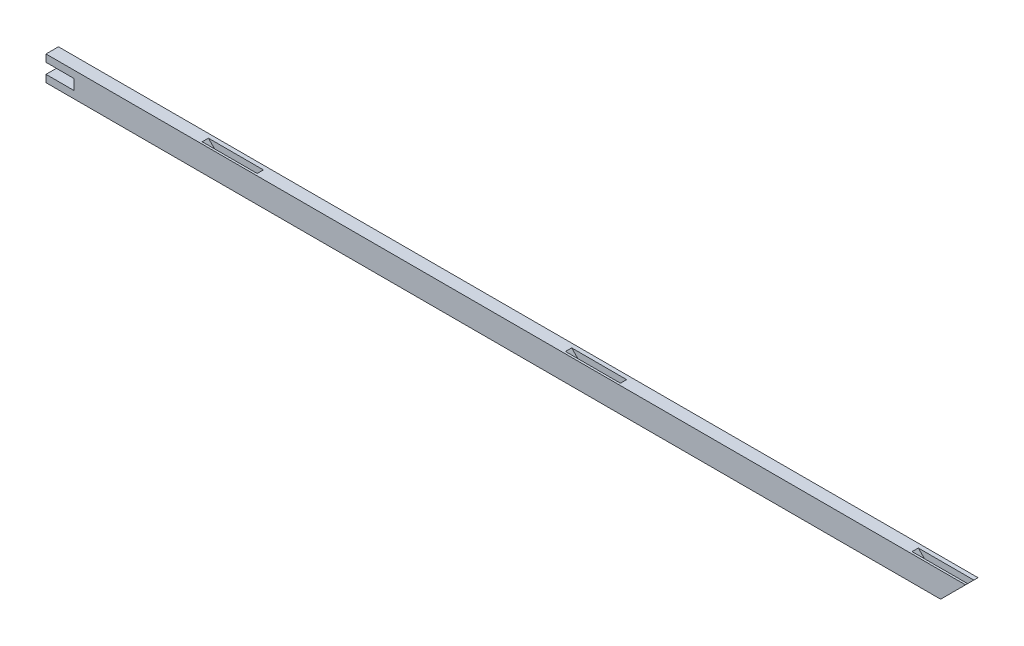
ISO-10303-21;
HEADER;
FILE_DESCRIPTION(('STEP AP214'),'2;1');
FILE_NAME('part.step','',(''),(''),'','','');
FILE_SCHEMA(('AUTOMOTIVE_DESIGN { 1 0 10303 214 1 1 1 1 }'));
ENDSEC;
DATA;
#1=APPLICATION_CONTEXT('core data for automotive mechanical design processes');
#2=APPLICATION_PROTOCOL_DEFINITION('international standard','automotive_design',2000,#1);
#3=PRODUCT_CONTEXT('',#1,'mechanical');
#4=PRODUCT('Part','Part','',(#3));
#5=PRODUCT_RELATED_PRODUCT_CATEGORY('part','',(#4));
#6=PRODUCT_DEFINITION_FORMATION('','',#4);
#7=PRODUCT_DEFINITION_CONTEXT('part definition',#1,'design');
#8=PRODUCT_DEFINITION('design','',#6,#7);
#9=PRODUCT_DEFINITION_SHAPE('','',#8);
#10=(LENGTH_UNIT() NAMED_UNIT(*) SI_UNIT(.MILLI.,.METRE.));
#11=(NAMED_UNIT(*) PLANE_ANGLE_UNIT() SI_UNIT($,.RADIAN.));
#12=(NAMED_UNIT(*) SI_UNIT($,.STERADIAN.) SOLID_ANGLE_UNIT());
#13=UNCERTAINTY_MEASURE_WITH_UNIT(LENGTH_MEASURE(1.E-05),#10,'distance_accuracy_value','');
#14=(GEOMETRIC_REPRESENTATION_CONTEXT(3) GLOBAL_UNCERTAINTY_ASSIGNED_CONTEXT((#13)) GLOBAL_UNIT_ASSIGNED_CONTEXT((#10,
#11,#12)) REPRESENTATION_CONTEXT('',''));
#15=CARTESIAN_POINT('',(0.,0.,0.));
#16=DIRECTION('',(0.,0.,1.));
#17=DIRECTION('',(1.,0.,0.));
#18=AXIS2_PLACEMENT_3D('',#15,#16,#17);
#19=CARTESIAN_POINT('',(886.,12.0000000000004,12.));
#20=DIRECTION('',(0.,-1.,0.));
#21=DIRECTION('',(1.,0.,0.));
#22=AXIS2_PLACEMENT_3D('',#19,#20,#21);
#23=PLANE('',#22);
#24=DIRECTION('',(0.,0.,1.));
#25=VECTOR('',#24,1.);
#26=CARTESIAN_POINT('',(148.5,12.,10.));
#27=LINE('',#26,#25);
#28=CARTESIAN_POINT('',(148.5,12.,10.));
#29=VERTEX_POINT('',#28);
#30=CARTESIAN_POINT('',(148.5,12.,4.));
#31=VERTEX_POINT('',#30);
#32=EDGE_CURVE('E437',#29,#31,#27,.F.);
#33=ORIENTED_EDGE('',*,*,#32,.T.);
#34=DIRECTION('',(1.,0.,0.));
#35=VECTOR('',#34,1.);
#36=CARTESIAN_POINT('',(155.,12.,4.));
#37=LINE('',#36,#35);
#38=CARTESIAN_POINT('',(201.5,12.,4.00000000000001));
#39=VERTEX_POINT('',#38);
#40=EDGE_CURVE('E451',#31,#39,#37,.T.);
#41=ORIENTED_EDGE('',*,*,#40,.T.);
#42=DIRECTION('',(0.,0.,-1.));
#43=VECTOR('',#42,1.);
#44=CARTESIAN_POINT('',(201.5,12.,4.00000000000001));
#45=LINE('',#44,#43);
#46=CARTESIAN_POINT('',(201.5,12.,10.));
#47=VERTEX_POINT('',#46);
#48=EDGE_CURVE('E457',#39,#47,#45,.F.);
#49=ORIENTED_EDGE('',*,*,#48,.T.);
#50=DIRECTION('',(-1.,0.,0.));
#51=VECTOR('',#50,1.);
#52=CARTESIAN_POINT('',(195.,12.,10.));
#53=LINE('',#52,#51);
#54=EDGE_CURVE('E425',#47,#29,#53,.T.);
#55=ORIENTED_EDGE('',*,*,#54,.T.);
#56=EDGE_LOOP('',(#33,#41,#49,#55));
#57=FACE_BOUND('',#56,.T.);
#58=DIRECTION('',(0.,0.,1.));
#59=VECTOR('',#58,1.);
#60=CARTESIAN_POINT('',(498.5,12.,10.));
#61=LINE('',#60,#59);
#62=CARTESIAN_POINT('',(498.5,12.,10.));
#63=VERTEX_POINT('',#62);
#64=CARTESIAN_POINT('',(498.5,12.,4.));
#65=VERTEX_POINT('',#64);
#66=EDGE_CURVE('E471',#63,#65,#61,.F.);
#67=ORIENTED_EDGE('',*,*,#66,.T.);
#68=DIRECTION('',(1.,0.,0.));
#69=VECTOR('',#68,1.);
#70=CARTESIAN_POINT('',(505.,12.,4.));
#71=LINE('',#70,#69);
#72=CARTESIAN_POINT('',(551.5,12.,4.00000000000001));
#73=VERTEX_POINT('',#72);
#74=EDGE_CURVE('E485',#65,#73,#71,.T.);
#75=ORIENTED_EDGE('',*,*,#74,.T.);
#76=DIRECTION('',(0.,0.,-1.));
#77=VECTOR('',#76,1.);
#78=CARTESIAN_POINT('',(551.5,12.,4.00000000000001));
#79=LINE('',#78,#77);
#80=CARTESIAN_POINT('',(551.5,12.,10.));
#81=VERTEX_POINT('',#80);
#82=EDGE_CURVE('E11',#73,#81,#79,.F.);
#83=ORIENTED_EDGE('',*,*,#82,.T.);
#84=DIRECTION('',(-1.,0.,0.));
#85=VECTOR('',#84,1.);
#86=CARTESIAN_POINT('',(545.,12.,10.));
#87=LINE('',#86,#85);
#88=EDGE_CURVE('E459',#81,#63,#87,.T.);
#89=ORIENTED_EDGE('',*,*,#88,.T.);
#90=EDGE_LOOP('',(#67,#75,#83,#89));
#91=FACE_BOUND('',#90,.T.);
#92=DIRECTION('',(-1.,0.,0.));
#93=VECTOR('',#92,1.);
#94=CARTESIAN_POINT('',(886.,12.0000000000004,4.));
#95=LINE('',#94,#93);
#96=CARTESIAN_POINT('',(886.,12.0000000000004,4.));
#97=VERTEX_POINT('',#96);
#98=CARTESIAN_POINT('',(832.5,12.0000000000004,4.));
#99=VERTEX_POINT('',#98);
#100=EDGE_CURVE('E256',#97,#99,#95,.T.);
#101=ORIENTED_EDGE('',*,*,#100,.F.);
#102=DIRECTION('',(0.,0.,-1.));
#103=VECTOR('',#102,1.);
#104=CARTESIAN_POINT('',(886.,12.0000000000004,12.));
#105=LINE('',#104,#103);
#106=CARTESIAN_POINT('',(886.,12.0000000000004,0.));
#107=VERTEX_POINT('',#106);
#108=EDGE_CURVE('E338',#97,#107,#105,.T.);
#109=ORIENTED_EDGE('',*,*,#108,.T.);
#110=DIRECTION('',(-1.,0.,0.));
#111=VECTOR('',#110,1.);
#112=CARTESIAN_POINT('',(886.,12.0000000000004,0.));
#113=LINE('',#112,#111);
#114=CARTESIAN_POINT('',(0.,12.0000000000002,0.));
#115=VERTEX_POINT('',#114);
#116=EDGE_CURVE('E339',#107,#115,#113,.T.);
#117=ORIENTED_EDGE('',*,*,#116,.T.);
#118=DIRECTION('',(0.,0.,-1.));
#119=VECTOR('',#118,1.);
#120=CARTESIAN_POINT('',(0.,12.0000000000002,12.));
#121=LINE('',#120,#119);
#122=CARTESIAN_POINT('',(0.,12.0000000000002,12.));
#123=VERTEX_POINT('',#122);
#124=EDGE_CURVE('E379',#123,#115,#121,.T.);
#125=ORIENTED_EDGE('',*,*,#124,.F.);
#126=DIRECTION('',(-1.,0.,0.));
#127=VECTOR('',#126,1.);
#128=CARTESIAN_POINT('',(886.,12.0000000000004,12.));
#129=LINE('',#128,#127);
#130=CARTESIAN_POINT('',(886.,12.0000000000004,12.));
#131=VERTEX_POINT('',#130);
#132=EDGE_CURVE('E320',#131,#123,#129,.T.);
#133=ORIENTED_EDGE('',*,*,#132,.F.);
#134=CARTESIAN_POINT('',(886.,12.0000000000004,10.));
#135=VERTEX_POINT('',#134);
#136=EDGE_CURVE('E358',#131,#135,#105,.T.);
#137=ORIENTED_EDGE('',*,*,#136,.T.);
#138=DIRECTION('',(-1.,0.,0.));
#139=VECTOR('',#138,1.);
#140=CARTESIAN_POINT('',(886.,12.0000000000004,10.));
#141=LINE('',#140,#139);
#142=CARTESIAN_POINT('',(832.5,12.0000000000004,10.));
#143=VERTEX_POINT('',#142);
#144=EDGE_CURVE('E58',#135,#143,#141,.T.);
#145=ORIENTED_EDGE('',*,*,#144,.T.);
#146=DIRECTION('',(0.,0.,1.));
#147=VECTOR('',#146,1.);
#148=CARTESIAN_POINT('',(832.5,12.0000000000004,4.));
#149=LINE('',#148,#147);
#150=EDGE_CURVE('E250',#99,#143,#149,.T.);
#151=ORIENTED_EDGE('',*,*,#150,.F.);
#152=EDGE_LOOP('',(#101,#109,#117,#125,#133,#137,#145,#151));
#153=FACE_BOUND('',#152,.T.);
#154=ADVANCED_FACE('F35',(#57,#91,#153),#23,.F.);
#155=CARTESIAN_POINT('',(862.,-12.,12.));
#156=DIRECTION('',(-0.707106781186551,0.707106781186544,0.));
#157=DIRECTION('',(-0.707106781186544,-0.707106781186551,0.));
#158=AXIS2_PLACEMENT_3D('',#155,#156,#157);
#159=PLANE('',#158);
#160=DIRECTION('',(0.707106781186532,0.707106781186562,0.));
#161=VECTOR('',#160,1.);
#162=CARTESIAN_POINT('',(879.5,5.50000000000037,4.));
#163=LINE('',#162,#161);
#164=CARTESIAN_POINT('',(879.5,5.50000000000037,4.));
#165=VERTEX_POINT('',#164);
#166=EDGE_CURVE('E261',#165,#97,#163,.T.);
#167=ORIENTED_EDGE('',*,*,#166,.F.);
#168=DIRECTION('',(0.,0.,1.));
#169=VECTOR('',#168,1.);
#170=CARTESIAN_POINT('',(879.5,5.50000000000037,4.));
#171=LINE('',#170,#169);
#172=CARTESIAN_POINT('',(879.5,5.50000000000037,10.));
#173=VERTEX_POINT('',#172);
#174=EDGE_CURVE('E268',#165,#173,#171,.T.);
#175=ORIENTED_EDGE('',*,*,#174,.T.);
#176=DIRECTION('',(0.707106781186532,0.707106781186562,0.));
#177=VECTOR('',#176,1.);
#178=CARTESIAN_POINT('',(879.5,5.50000000000037,10.));
#179=LINE('',#178,#177);
#180=EDGE_CURVE('E264',#173,#135,#179,.T.);
#181=ORIENTED_EDGE('',*,*,#180,.T.);
#182=ORIENTED_EDGE('',*,*,#136,.F.);
#183=DIRECTION('',(0.707106781186544,0.707106781186551,0.));
#184=VECTOR('',#183,1.);
#185=CARTESIAN_POINT('',(862.,-12.,12.));
#186=LINE('',#185,#184);
#187=CARTESIAN_POINT('',(862.,-12.,12.));
#188=VERTEX_POINT('',#187);
#189=EDGE_CURVE('E336',#188,#131,#186,.T.);
#190=ORIENTED_EDGE('',*,*,#189,.F.);
#191=DIRECTION('',(0.,0.,-1.));
#192=VECTOR('',#191,1.);
#193=CARTESIAN_POINT('',(862.,-12.,12.));
#194=LINE('',#193,#192);
#195=CARTESIAN_POINT('',(862.,-12.,10.));
#196=VERTEX_POINT('',#195);
#197=EDGE_CURVE('E361',#188,#196,#194,.T.);
#198=ORIENTED_EDGE('',*,*,#197,.T.);
#199=DIRECTION('',(0.707106781186545,0.70710678118655,0.));
#200=VECTOR('',#199,1.);
#201=CARTESIAN_POINT('',(868.5,-5.50000000000001,10.));
#202=LINE('',#201,#200);
#203=CARTESIAN_POINT('',(868.5,-5.50000000000001,10.));
#204=VERTEX_POINT('',#203);
#205=EDGE_CURVE('E286',#196,#204,#202,.T.);
#206=ORIENTED_EDGE('',*,*,#205,.T.);
#207=DIRECTION('',(0.,0.,1.));
#208=VECTOR('',#207,1.);
#209=CARTESIAN_POINT('',(868.5,-5.50000000000001,4.));
#210=LINE('',#209,#208);
#211=CARTESIAN_POINT('',(868.5,-5.50000000000001,4.));
#212=VERTEX_POINT('',#211);
#213=EDGE_CURVE('E285',#212,#204,#210,.T.);
#214=ORIENTED_EDGE('',*,*,#213,.F.);
#215=DIRECTION('',(0.707106781186545,0.70710678118655,0.));
#216=VECTOR('',#215,1.);
#217=CARTESIAN_POINT('',(868.5,-5.50000000000001,4.));
#218=LINE('',#217,#216);
#219=CARTESIAN_POINT('',(862.,-12.,4.));
#220=VERTEX_POINT('',#219);
#221=EDGE_CURVE('E273',#220,#212,#218,.T.);
#222=ORIENTED_EDGE('',*,*,#221,.F.);
#223=CARTESIAN_POINT('',(862.,-12.,0.));
#224=VERTEX_POINT('',#223);
#225=EDGE_CURVE('E360',#220,#224,#194,.T.);
#226=ORIENTED_EDGE('',*,*,#225,.T.);
#227=DIRECTION('',(0.707106781186544,0.707106781186551,0.));
#228=VECTOR('',#227,1.);
#229=CARTESIAN_POINT('',(862.,-12.,0.));
#230=LINE('',#229,#228);
#231=EDGE_CURVE('E324',#224,#107,#230,.T.);
#232=ORIENTED_EDGE('',*,*,#231,.T.);
#233=ORIENTED_EDGE('',*,*,#108,.F.);
#234=EDGE_LOOP('',(#167,#175,#181,#182,#190,#198,#206,#214,#222,#226,#232,#233));
#235=FACE_BOUND('',#234,.T.);
#236=ADVANCED_FACE('F505',(#235),#159,.F.);
#237=CARTESIAN_POINT('',(545.,5.5,4.00000000000001));
#238=DIRECTION('',(-0.707106781186546,0.707106781186549,0.));
#239=DIRECTION('',(0.707106781186549,0.707106781186546,0.));
#240=AXIS2_PLACEMENT_3D('',#237,#238,#239);
#241=PLANE('',#240);
#242=ORIENTED_EDGE('',*,*,#82,.F.);
#243=DIRECTION('',(-0.707106781186549,-0.707106781186546,0.));
#244=VECTOR('',#243,1.);
#245=CARTESIAN_POINT('',(525.,-14.5,4.));
#246=LINE('',#245,#244);
#247=CARTESIAN_POINT('',(545.,5.5,4.00000000000001));
#248=VERTEX_POINT('',#247);
#249=EDGE_CURVE('E43',#248,#73,#246,.F.);
#250=ORIENTED_EDGE('',*,*,#249,.F.);
#251=DIRECTION('',(0.,0.,1.));
#252=VECTOR('',#251,1.);
#253=CARTESIAN_POINT('',(545.,5.5,4.00000000000001));
#254=LINE('',#253,#252);
#255=CARTESIAN_POINT('',(545.,5.5,10.));
#256=VERTEX_POINT('',#255);
#257=EDGE_CURVE('E483',#248,#256,#254,.T.);
#258=ORIENTED_EDGE('',*,*,#257,.T.);
#259=DIRECTION('',(-0.707106781186549,-0.707106781186546,0.));
#260=VECTOR('',#259,1.);
#261=CARTESIAN_POINT('',(545.,5.5,10.));
#262=LINE('',#261,#260);
#263=EDGE_CURVE('E468',#256,#81,#262,.F.);
#264=ORIENTED_EDGE('',*,*,#263,.T.);
#265=EDGE_LOOP('',(#242,#250,#258,#264));
#266=FACE_BOUND('',#265,.T.);
#267=ADVANCED_FACE('F37',(#266),#241,.T.);
#268=CARTESIAN_POINT('',(505.,5.5,4.));
#269=DIRECTION('',(0.,0.,-1.));
#270=DIRECTION('',(-1.,0.,0.));
#271=AXIS2_PLACEMENT_3D('',#268,#269,#270);
#272=PLANE('',#271);
#273=ORIENTED_EDGE('',*,*,#74,.F.);
#274=DIRECTION('',(0.707106781186549,-0.707106781186546,0.));
#275=VECTOR('',#274,1.);
#276=CARTESIAN_POINT('',(505.,5.5,4.));
#277=LINE('',#276,#275);
#278=CARTESIAN_POINT('',(505.,5.5,4.));
#279=VERTEX_POINT('',#278);
#280=EDGE_CURVE('E474',#279,#65,#277,.F.);
#281=ORIENTED_EDGE('',*,*,#280,.F.);
#282=DIRECTION('',(1.,0.,0.));
#283=VECTOR('',#282,1.);
#284=CARTESIAN_POINT('',(505.,5.5,4.));
#285=LINE('',#284,#283);
#286=EDGE_CURVE('E480',#279,#248,#285,.T.);
#287=ORIENTED_EDGE('',*,*,#286,.T.);
#288=ORIENTED_EDGE('',*,*,#249,.T.);
#289=EDGE_LOOP('',(#273,#281,#287,#288));
#290=FACE_BOUND('',#289,.T.);
#291=ADVANCED_FACE('F489',(#290),#272,.F.);
#292=CARTESIAN_POINT('',(350.,5.5,0.));
#293=DIRECTION('',(0.,1.,0.));
#294=DIRECTION('',(0.,0.,-1.));
#295=AXIS2_PLACEMENT_3D('',#292,#293,#294);
#296=PLANE('',#295);
#297=DIRECTION('',(-1.,0.,0.));
#298=VECTOR('',#297,1.);
#299=CARTESIAN_POINT('',(545.,5.5,10.));
#300=LINE('',#299,#298);
#301=CARTESIAN_POINT('',(505.,5.5,10.));
#302=VERTEX_POINT('',#301);
#303=EDGE_CURVE('E465',#256,#302,#300,.T.);
#304=ORIENTED_EDGE('',*,*,#303,.F.);
#305=ORIENTED_EDGE('',*,*,#257,.F.);
#306=ORIENTED_EDGE('',*,*,#286,.F.);
#307=DIRECTION('',(0.,0.,-1.));
#308=VECTOR('',#307,1.);
#309=CARTESIAN_POINT('',(505.,5.5,10.));
#310=LINE('',#309,#308);
#311=EDGE_CURVE('E477',#302,#279,#310,.T.);
#312=ORIENTED_EDGE('',*,*,#311,.F.);
#313=EDGE_LOOP('',(#304,#305,#306,#312));
#314=FACE_BOUND('',#313,.T.);
#315=ADVANCED_FACE('F503',(#314),#296,.T.);
#316=CARTESIAN_POINT('',(505.,5.5,10.));
#317=DIRECTION('',(0.707106781186546,0.707106781186549,0.));
#318=DIRECTION('',(0.707106781186549,-0.707106781186546,0.));
#319=AXIS2_PLACEMENT_3D('',#316,#317,#318);
#320=PLANE('',#319);
#321=ORIENTED_EDGE('',*,*,#66,.F.);
#322=DIRECTION('',(0.707106781186549,-0.707106781186546,0.));
#323=VECTOR('',#322,1.);
#324=CARTESIAN_POINT('',(525.,-14.5,10.));
#325=LINE('',#324,#323);
#326=EDGE_CURVE('E462',#302,#63,#325,.F.);
#327=ORIENTED_EDGE('',*,*,#326,.F.);
#328=ORIENTED_EDGE('',*,*,#311,.T.);
#329=ORIENTED_EDGE('',*,*,#280,.T.);
#330=EDGE_LOOP('',(#321,#327,#328,#329));
#331=FACE_BOUND('',#330,.T.);
#332=ADVANCED_FACE('F497',(#331),#320,.T.);
#333=CARTESIAN_POINT('',(545.,5.5,10.));
#334=DIRECTION('',(0.,0.,1.));
#335=DIRECTION('',(1.,0.,0.));
#336=AXIS2_PLACEMENT_3D('',#333,#334,#335);
#337=PLANE('',#336);
#338=ORIENTED_EDGE('',*,*,#88,.F.);
#339=ORIENTED_EDGE('',*,*,#263,.F.);
#340=ORIENTED_EDGE('',*,*,#303,.T.);
#341=ORIENTED_EDGE('',*,*,#326,.T.);
#342=EDGE_LOOP('',(#338,#339,#340,#341));
#343=FACE_BOUND('',#342,.T.);
#344=ADVANCED_FACE('F499',(#343),#337,.F.);
#345=CARTESIAN_POINT('',(195.,5.5,4.00000000000001));
#346=DIRECTION('',(-0.707106781186546,0.707106781186549,0.));
#347=DIRECTION('',(0.707106781186549,0.707106781186546,0.));
#348=AXIS2_PLACEMENT_3D('',#345,#346,#347);
#349=PLANE('',#348);
#350=ORIENTED_EDGE('',*,*,#48,.F.);
#351=DIRECTION('',(-0.707106781186549,-0.707106781186546,0.));
#352=VECTOR('',#351,1.);
#353=CARTESIAN_POINT('',(175.,-14.5,4.));
#354=LINE('',#353,#352);
#355=CARTESIAN_POINT('',(195.,5.5,4.00000000000001));
#356=VERTEX_POINT('',#355);
#357=EDGE_CURVE('E454',#356,#39,#354,.F.);
#358=ORIENTED_EDGE('',*,*,#357,.F.);
#359=DIRECTION('',(0.,0.,1.));
#360=VECTOR('',#359,1.);
#361=CARTESIAN_POINT('',(195.,5.5,4.00000000000001));
#362=LINE('',#361,#360);
#363=CARTESIAN_POINT('',(195.,5.5,10.));
#364=VERTEX_POINT('',#363);
#365=EDGE_CURVE('E449',#356,#364,#362,.T.);
#366=ORIENTED_EDGE('',*,*,#365,.T.);
#367=DIRECTION('',(-0.707106781186549,-0.707106781186546,0.));
#368=VECTOR('',#367,1.);
#369=CARTESIAN_POINT('',(195.,5.5,10.));
#370=LINE('',#369,#368);
#371=EDGE_CURVE('E434',#364,#47,#370,.F.);
#372=ORIENTED_EDGE('',*,*,#371,.T.);
#373=EDGE_LOOP('',(#350,#358,#366,#372));
#374=FACE_BOUND('',#373,.T.);
#375=ADVANCED_FACE('F567',(#374),#349,.T.);
#376=CARTESIAN_POINT('',(155.,5.5,4.));
#377=DIRECTION('',(0.,0.,-1.));
#378=DIRECTION('',(-1.,0.,0.));
#379=AXIS2_PLACEMENT_3D('',#376,#377,#378);
#380=PLANE('',#379);
#381=ORIENTED_EDGE('',*,*,#40,.F.);
#382=DIRECTION('',(0.707106781186549,-0.707106781186546,0.));
#383=VECTOR('',#382,1.);
#384=CARTESIAN_POINT('',(155.,5.5,4.));
#385=LINE('',#384,#383);
#386=CARTESIAN_POINT('',(155.,5.5,4.));
#387=VERTEX_POINT('',#386);
#388=EDGE_CURVE('E440',#387,#31,#385,.F.);
#389=ORIENTED_EDGE('',*,*,#388,.F.);
#390=DIRECTION('',(1.,0.,0.));
#391=VECTOR('',#390,1.);
#392=CARTESIAN_POINT('',(155.,5.5,4.));
#393=LINE('',#392,#391);
#394=EDGE_CURVE('E446',#387,#356,#393,.T.);
#395=ORIENTED_EDGE('',*,*,#394,.T.);
#396=ORIENTED_EDGE('',*,*,#357,.T.);
#397=EDGE_LOOP('',(#381,#389,#395,#396));
#398=FACE_BOUND('',#397,.T.);
#399=ADVANCED_FACE('F563',(#398),#380,.F.);
#400=CARTESIAN_POINT('',(0.,5.5,0.));
#401=DIRECTION('',(0.,1.,0.));
#402=DIRECTION('',(0.,0.,-1.));
#403=AXIS2_PLACEMENT_3D('',#400,#401,#402);
#404=PLANE('',#403);
#405=DIRECTION('',(-1.,0.,0.));
#406=VECTOR('',#405,1.);
#407=CARTESIAN_POINT('',(195.,5.5,10.));
#408=LINE('',#407,#406);
#409=CARTESIAN_POINT('',(155.,5.5,10.));
#410=VERTEX_POINT('',#409);
#411=EDGE_CURVE('E431',#364,#410,#408,.T.);
#412=ORIENTED_EDGE('',*,*,#411,.F.);
#413=ORIENTED_EDGE('',*,*,#365,.F.);
#414=ORIENTED_EDGE('',*,*,#394,.F.);
#415=DIRECTION('',(0.,0.,-1.));
#416=VECTOR('',#415,1.);
#417=CARTESIAN_POINT('',(155.,5.5,10.));
#418=LINE('',#417,#416);
#419=EDGE_CURVE('E443',#410,#387,#418,.T.);
#420=ORIENTED_EDGE('',*,*,#419,.F.);
#421=EDGE_LOOP('',(#412,#413,#414,#420));
#422=FACE_BOUND('',#421,.T.);
#423=ADVANCED_FACE('F559',(#422),#404,.T.);
#424=CARTESIAN_POINT('',(155.,5.5,10.));
#425=DIRECTION('',(0.707106781186546,0.707106781186549,0.));
#426=DIRECTION('',(0.707106781186549,-0.707106781186546,0.));
#427=AXIS2_PLACEMENT_3D('',#424,#425,#426);
#428=PLANE('',#427);
#429=ORIENTED_EDGE('',*,*,#32,.F.);
#430=DIRECTION('',(0.707106781186549,-0.707106781186546,0.));
#431=VECTOR('',#430,1.);
#432=CARTESIAN_POINT('',(175.,-14.5,10.));
#433=LINE('',#432,#431);
#434=EDGE_CURVE('E428',#410,#29,#433,.F.);
#435=ORIENTED_EDGE('',*,*,#434,.F.);
#436=ORIENTED_EDGE('',*,*,#419,.T.);
#437=ORIENTED_EDGE('',*,*,#388,.T.);
#438=EDGE_LOOP('',(#429,#435,#436,#437));
#439=FACE_BOUND('',#438,.T.);
#440=ADVANCED_FACE('F555',(#439),#428,.T.);
#441=CARTESIAN_POINT('',(195.,5.5,10.));
#442=DIRECTION('',(0.,0.,1.));
#443=DIRECTION('',(1.,0.,0.));
#444=AXIS2_PLACEMENT_3D('',#441,#442,#443);
#445=PLANE('',#444);
#446=ORIENTED_EDGE('',*,*,#54,.F.);
#447=ORIENTED_EDGE('',*,*,#371,.F.);
#448=ORIENTED_EDGE('',*,*,#411,.T.);
#449=ORIENTED_EDGE('',*,*,#434,.T.);
#450=EDGE_LOOP('',(#446,#447,#448,#449));
#451=FACE_BOUND('',#450,.T.);
#452=ADVANCED_FACE('F551',(#451),#445,.F.);
#453=CARTESIAN_POINT('',(545.,-5.5,4.00000000000001));
#454=DIRECTION('',(-0.707106781186546,-0.707106781186549,0.));
#455=DIRECTION('',(0.707106781186549,-0.707106781186546,0.));
#456=AXIS2_PLACEMENT_3D('',#453,#454,#455);
#457=PLANE('',#456);
#458=DIRECTION('',(0.,0.,-1.));
#459=VECTOR('',#458,1.);
#460=CARTESIAN_POINT('',(551.5,-12.,4.00000000000001));
#461=LINE('',#460,#459);
#462=CARTESIAN_POINT('',(551.5,-12.,4.00000000000001));
#463=VERTEX_POINT('',#462);
#464=CARTESIAN_POINT('',(551.5,-12.,10.));
#465=VERTEX_POINT('',#464);
#466=EDGE_CURVE('E422',#463,#465,#461,.F.);
#467=ORIENTED_EDGE('',*,*,#466,.T.);
#468=DIRECTION('',(-0.707106781186549,0.707106781186546,0.));
#469=VECTOR('',#468,1.);
#470=CARTESIAN_POINT('',(545.,-5.5,10.));
#471=LINE('',#470,#469);
#472=CARTESIAN_POINT('',(545.,-5.5,10.));
#473=VERTEX_POINT('',#472);
#474=EDGE_CURVE('E401',#473,#465,#471,.F.);
#475=ORIENTED_EDGE('',*,*,#474,.F.);
#476=DIRECTION('',(0.,0.,1.));
#477=VECTOR('',#476,1.);
#478=CARTESIAN_POINT('',(545.,-5.5,4.00000000000001));
#479=LINE('',#478,#477);
#480=CARTESIAN_POINT('',(545.,-5.5,4.00000000000001));
#481=VERTEX_POINT('',#480);
#482=EDGE_CURVE('E414',#481,#473,#479,.T.);
#483=ORIENTED_EDGE('',*,*,#482,.F.);
#484=DIRECTION('',(-0.707106781186549,0.707106781186546,0.));
#485=VECTOR('',#484,1.);
#486=CARTESIAN_POINT('',(525.,14.5,4.));
#487=LINE('',#486,#485);
#488=EDGE_CURVE('E419',#481,#463,#487,.F.);
#489=ORIENTED_EDGE('',*,*,#488,.T.);
#490=EDGE_LOOP('',(#467,#475,#483,#489));
#491=FACE_BOUND('',#490,.T.);
#492=ADVANCED_FACE('F547',(#491),#457,.T.);
#493=CARTESIAN_POINT('',(505.,-5.5,4.));
#494=DIRECTION('',(0.,0.,-1.));
#495=DIRECTION('',(-1.,0.,0.));
#496=AXIS2_PLACEMENT_3D('',#493,#494,#495);
#497=PLANE('',#496);
#498=DIRECTION('',(1.,0.,0.));
#499=VECTOR('',#498,1.);
#500=CARTESIAN_POINT('',(505.,-12.,4.));
#501=LINE('',#500,#499);
#502=CARTESIAN_POINT('',(498.5,-12.,4.));
#503=VERTEX_POINT('',#502);
#504=EDGE_CURVE('E417',#503,#463,#501,.T.);
#505=ORIENTED_EDGE('',*,*,#504,.T.);
#506=ORIENTED_EDGE('',*,*,#488,.F.);
#507=DIRECTION('',(1.,0.,0.));
#508=VECTOR('',#507,1.);
#509=CARTESIAN_POINT('',(505.,-5.5,4.));
#510=LINE('',#509,#508);
#511=CARTESIAN_POINT('',(505.,-5.5,4.));
#512=VERTEX_POINT('',#511);
#513=EDGE_CURVE('E412',#512,#481,#510,.T.);
#514=ORIENTED_EDGE('',*,*,#513,.F.);
#515=DIRECTION('',(0.707106781186549,0.707106781186546,0.));
#516=VECTOR('',#515,1.);
#517=CARTESIAN_POINT('',(505.,-5.5,4.));
#518=LINE('',#517,#516);
#519=EDGE_CURVE('E406',#512,#503,#518,.F.);
#520=ORIENTED_EDGE('',*,*,#519,.T.);
#521=EDGE_LOOP('',(#505,#506,#514,#520));
#522=FACE_BOUND('',#521,.T.);
#523=ADVANCED_FACE('F543',(#522),#497,.F.);
#524=CARTESIAN_POINT('',(350.,-5.5,0.));
#525=DIRECTION('',(0.,-1.,0.));
#526=DIRECTION('',(0.,0.,-1.));
#527=AXIS2_PLACEMENT_3D('',#524,#525,#526);
#528=PLANE('',#527);
#529=DIRECTION('',(-1.,0.,0.));
#530=VECTOR('',#529,1.);
#531=CARTESIAN_POINT('',(545.,-5.5,10.));
#532=LINE('',#531,#530);
#533=CARTESIAN_POINT('',(505.,-5.5,10.));
#534=VERTEX_POINT('',#533);
#535=EDGE_CURVE('E398',#473,#534,#532,.T.);
#536=ORIENTED_EDGE('',*,*,#535,.T.);
#537=DIRECTION('',(0.,0.,-1.));
#538=VECTOR('',#537,1.);
#539=CARTESIAN_POINT('',(505.,-5.5,10.));
#540=LINE('',#539,#538);
#541=EDGE_CURVE('E409',#534,#512,#540,.T.);
#542=ORIENTED_EDGE('',*,*,#541,.T.);
#543=ORIENTED_EDGE('',*,*,#513,.T.);
#544=ORIENTED_EDGE('',*,*,#482,.T.);
#545=EDGE_LOOP('',(#536,#542,#543,#544));
#546=FACE_BOUND('',#545,.T.);
#547=ADVANCED_FACE('F539',(#546),#528,.T.);
#548=CARTESIAN_POINT('',(505.,-5.5,10.));
#549=DIRECTION('',(0.707106781186546,-0.707106781186549,0.));
#550=DIRECTION('',(0.707106781186549,0.707106781186546,0.));
#551=AXIS2_PLACEMENT_3D('',#548,#549,#550);
#552=PLANE('',#551);
#553=DIRECTION('',(0.,0.,1.));
#554=VECTOR('',#553,1.);
#555=CARTESIAN_POINT('',(498.5,-12.,10.));
#556=LINE('',#555,#554);
#557=CARTESIAN_POINT('',(498.5,-12.,10.));
#558=VERTEX_POINT('',#557);
#559=EDGE_CURVE('E404',#558,#503,#556,.F.);
#560=ORIENTED_EDGE('',*,*,#559,.T.);
#561=ORIENTED_EDGE('',*,*,#519,.F.);
#562=ORIENTED_EDGE('',*,*,#541,.F.);
#563=DIRECTION('',(0.707106781186549,0.707106781186546,0.));
#564=VECTOR('',#563,1.);
#565=CARTESIAN_POINT('',(525.,14.5,10.));
#566=LINE('',#565,#564);
#567=EDGE_CURVE('E395',#534,#558,#566,.F.);
#568=ORIENTED_EDGE('',*,*,#567,.T.);
#569=EDGE_LOOP('',(#560,#561,#562,#568));
#570=FACE_BOUND('',#569,.T.);
#571=ADVANCED_FACE('F535',(#570),#552,.T.);
#572=CARTESIAN_POINT('',(545.,-5.5,10.));
#573=DIRECTION('',(0.,0.,1.));
#574=DIRECTION('',(1.,0.,0.));
#575=AXIS2_PLACEMENT_3D('',#572,#573,#574);
#576=PLANE('',#575);
#577=DIRECTION('',(-1.,0.,0.));
#578=VECTOR('',#577,1.);
#579=CARTESIAN_POINT('',(545.,-12.,10.));
#580=LINE('',#579,#578);
#581=EDGE_CURVE('E382',#465,#558,#580,.T.);
#582=ORIENTED_EDGE('',*,*,#581,.T.);
#583=ORIENTED_EDGE('',*,*,#567,.F.);
#584=ORIENTED_EDGE('',*,*,#535,.F.);
#585=ORIENTED_EDGE('',*,*,#474,.T.);
#586=EDGE_LOOP('',(#582,#583,#584,#585));
#587=FACE_BOUND('',#586,.T.);
#588=ADVANCED_FACE('F532',(#587),#576,.F.);
#589=CARTESIAN_POINT('',(0.,12.0000000000002,12.));
#590=DIRECTION('',(1.,0.,0.));
#591=DIRECTION('',(0.,0.,-1.));
#592=AXIS2_PLACEMENT_3D('',#589,#590,#591);
#593=PLANE('',#592);
#594=DIRECTION('',(0.,-1.,0.));
#595=VECTOR('',#594,1.);
#596=CARTESIAN_POINT('',(0.,12.0000000000002,0.));
#597=LINE('',#596,#595);
#598=CARTESIAN_POINT('',(0.,5.00000000000008,0.));
#599=VERTEX_POINT('',#598);
#600=EDGE_CURVE('E342',#115,#599,#597,.T.);
#601=ORIENTED_EDGE('',*,*,#600,.T.);
#602=DIRECTION('',(0.,0.,-1.));
#603=VECTOR('',#602,1.);
#604=CARTESIAN_POINT('',(0.,5.00000000000008,12.));
#605=LINE('',#604,#603);
#606=CARTESIAN_POINT('',(0.,5.00000000000008,12.));
#607=VERTEX_POINT('',#606);
#608=EDGE_CURVE('E376',#607,#599,#605,.T.);
#609=ORIENTED_EDGE('',*,*,#608,.F.);
#610=DIRECTION('',(0.,-1.,0.));
#611=VECTOR('',#610,1.);
#612=CARTESIAN_POINT('',(0.,12.0000000000002,12.));
#613=LINE('',#612,#611);
#614=EDGE_CURVE('E323',#123,#607,#613,.T.);
#615=ORIENTED_EDGE('',*,*,#614,.F.);
#616=ORIENTED_EDGE('',*,*,#124,.T.);
#617=EDGE_LOOP('',(#601,#609,#615,#616));
#618=FACE_BOUND('',#617,.T.);
#619=ADVANCED_FACE('F519',(#618),#593,.F.);
#620=CARTESIAN_POINT('',(0.,5.00000000000008,12.));
#621=DIRECTION('',(0.,1.,0.));
#622=DIRECTION('',(-1.,0.,0.));
#623=AXIS2_PLACEMENT_3D('',#620,#621,#622);
#624=PLANE('',#623);
#625=DIRECTION('',(1.,0.,0.));
#626=VECTOR('',#625,1.);
#627=CARTESIAN_POINT('',(0.,5.00000000000008,0.));
#628=LINE('',#627,#626);
#629=CARTESIAN_POINT('',(27.,5.00000000000008,0.));
#630=VERTEX_POINT('',#629);
#631=EDGE_CURVE('E345',#599,#630,#628,.T.);
#632=ORIENTED_EDGE('',*,*,#631,.T.);
#633=DIRECTION('',(0.,0.,-1.));
#634=VECTOR('',#633,1.);
#635=CARTESIAN_POINT('',(27.,5.00000000000008,12.));
#636=LINE('',#635,#634);
#637=CARTESIAN_POINT('',(27.,5.00000000000008,12.));
#638=VERTEX_POINT('',#637);
#639=EDGE_CURVE('E373',#638,#630,#636,.T.);
#640=ORIENTED_EDGE('',*,*,#639,.F.);
#641=DIRECTION('',(1.,0.,0.));
#642=VECTOR('',#641,1.);
#643=CARTESIAN_POINT('',(0.,5.00000000000008,12.));
#644=LINE('',#643,#642);
#645=EDGE_CURVE('E326',#607,#638,#644,.T.);
#646=ORIENTED_EDGE('',*,*,#645,.F.);
#647=ORIENTED_EDGE('',*,*,#608,.T.);
#648=EDGE_LOOP('',(#632,#640,#646,#647));
#649=FACE_BOUND('',#648,.T.);
#650=ADVANCED_FACE('F636',(#649),#624,.F.);
#651=CARTESIAN_POINT('',(27.,5.00000000000008,12.));
#652=DIRECTION('',(1.,0.,0.));
#653=DIRECTION('',(0.,0.,-1.));
#654=AXIS2_PLACEMENT_3D('',#651,#652,#653);
#655=PLANE('',#654);
#656=DIRECTION('',(0.,-1.,0.));
#657=VECTOR('',#656,1.);
#658=CARTESIAN_POINT('',(27.,5.00000000000008,0.));
#659=LINE('',#658,#657);
#660=CARTESIAN_POINT('',(27.,-4.99999999999992,0.));
#661=VERTEX_POINT('',#660);
#662=EDGE_CURVE('E347',#630,#661,#659,.T.);
#663=ORIENTED_EDGE('',*,*,#662,.T.);
#664=DIRECTION('',(0.,0.,-1.));
#665=VECTOR('',#664,1.);
#666=CARTESIAN_POINT('',(27.,-4.99999999999992,12.));
#667=LINE('',#666,#665);
#668=CARTESIAN_POINT('',(27.,-4.99999999999992,12.));
#669=VERTEX_POINT('',#668);
#670=EDGE_CURVE('E370',#669,#661,#667,.T.);
#671=ORIENTED_EDGE('',*,*,#670,.F.);
#672=DIRECTION('',(0.,-1.,0.));
#673=VECTOR('',#672,1.);
#674=CARTESIAN_POINT('',(27.,5.00000000000008,12.));
#675=LINE('',#674,#673);
#676=EDGE_CURVE('E328',#638,#669,#675,.T.);
#677=ORIENTED_EDGE('',*,*,#676,.F.);
#678=ORIENTED_EDGE('',*,*,#639,.T.);
#679=EDGE_LOOP('',(#663,#671,#677,#678));
#680=FACE_BOUND('',#679,.T.);
#681=ADVANCED_FACE('F643',(#680),#655,.F.);
#682=CARTESIAN_POINT('',(27.,-4.99999999999992,12.));
#683=DIRECTION('',(0.,-1.,0.));
#684=DIRECTION('',(1.,0.,0.));
#685=AXIS2_PLACEMENT_3D('',#682,#683,#684);
#686=PLANE('',#685);
#687=DIRECTION('',(-1.,0.,0.));
#688=VECTOR('',#687,1.);
#689=CARTESIAN_POINT('',(27.,-4.99999999999992,0.));
#690=LINE('',#689,#688);
#691=CARTESIAN_POINT('',(0.,-4.99999999999992,0.));
#692=VERTEX_POINT('',#691);
#693=EDGE_CURVE('E349',#661,#692,#690,.T.);
#694=ORIENTED_EDGE('',*,*,#693,.T.);
#695=DIRECTION('',(0.,0.,-1.));
#696=VECTOR('',#695,1.);
#697=CARTESIAN_POINT('',(0.,-4.99999999999992,12.));
#698=LINE('',#697,#696);
#699=CARTESIAN_POINT('',(0.,-4.99999999999992,12.));
#700=VERTEX_POINT('',#699);
#701=EDGE_CURVE('E367',#700,#692,#698,.T.);
#702=ORIENTED_EDGE('',*,*,#701,.F.);
#703=DIRECTION('',(-1.,0.,0.));
#704=VECTOR('',#703,1.);
#705=CARTESIAN_POINT('',(27.,-4.99999999999992,12.));
#706=LINE('',#705,#704);
#707=EDGE_CURVE('E330',#669,#700,#706,.T.);
#708=ORIENTED_EDGE('',*,*,#707,.F.);
#709=ORIENTED_EDGE('',*,*,#670,.T.);
#710=EDGE_LOOP('',(#694,#702,#708,#709));
#711=FACE_BOUND('',#710,.T.);
#712=ADVANCED_FACE('F650',(#711),#686,.F.);
#713=CARTESIAN_POINT('',(0.,-4.99999999999992,12.));
#714=DIRECTION('',(1.,0.,0.));
#715=DIRECTION('',(0.,0.,-1.));
#716=AXIS2_PLACEMENT_3D('',#713,#714,#715);
#717=PLANE('',#716);
#718=DIRECTION('',(0.,-1.,0.));
#719=VECTOR('',#718,1.);
#720=CARTESIAN_POINT('',(0.,-4.99999999999992,0.));
#721=LINE('',#720,#719);
#722=CARTESIAN_POINT('',(0.,-12.,0.));
#723=VERTEX_POINT('',#722);
#724=EDGE_CURVE('E351',#692,#723,#721,.T.);
#725=ORIENTED_EDGE('',*,*,#724,.T.);
#726=DIRECTION('',(0.,0.,-1.));
#727=VECTOR('',#726,1.);
#728=CARTESIAN_POINT('',(0.,-12.,12.));
#729=LINE('',#728,#727);
#730=CARTESIAN_POINT('',(0.,-12.,12.));
#731=VERTEX_POINT('',#730);
#732=EDGE_CURVE('E364',#731,#723,#729,.T.);
#733=ORIENTED_EDGE('',*,*,#732,.F.);
#734=DIRECTION('',(0.,-1.,0.));
#735=VECTOR('',#734,1.);
#736=CARTESIAN_POINT('',(0.,-4.99999999999992,12.));
#737=LINE('',#736,#735);
#738=EDGE_CURVE('E332',#700,#731,#737,.T.);
#739=ORIENTED_EDGE('',*,*,#738,.F.);
#740=ORIENTED_EDGE('',*,*,#701,.T.);
#741=EDGE_LOOP('',(#725,#733,#739,#740));
#742=FACE_BOUND('',#741,.T.);
#743=ADVANCED_FACE('F658',(#742),#717,.F.);
#744=CARTESIAN_POINT('',(0.,-12.,12.));
#745=DIRECTION('',(0.,1.,0.));
#746=DIRECTION('',(-1.,0.,0.));
#747=AXIS2_PLACEMENT_3D('',#744,#745,#746);
#748=PLANE('',#747);
#749=ORIENTED_EDGE('',*,*,#559,.F.);
#750=ORIENTED_EDGE('',*,*,#581,.F.);
#751=ORIENTED_EDGE('',*,*,#466,.F.);
#752=ORIENTED_EDGE('',*,*,#504,.F.);
#753=EDGE_LOOP('',(#749,#750,#751,#752));
#754=FACE_BOUND('',#753,.T.);
#755=DIRECTION('',(0.,0.,1.));
#756=VECTOR('',#755,1.);
#757=CARTESIAN_POINT('',(148.5,-12.,10.));
#758=LINE('',#757,#756);
#759=CARTESIAN_POINT('',(148.5,-12.,10.));
#760=VERTEX_POINT('',#759);
#761=CARTESIAN_POINT('',(148.5,-12.,4.));
#762=VERTEX_POINT('',#761);
#763=EDGE_CURVE('E316',#760,#762,#758,.F.);
#764=ORIENTED_EDGE('',*,*,#763,.F.);
#765=DIRECTION('',(-1.,0.,0.));
#766=VECTOR('',#765,1.);
#767=CARTESIAN_POINT('',(195.,-12.,10.));
#768=LINE('',#767,#766);
#769=CARTESIAN_POINT('',(201.5,-12.,10.));
#770=VERTEX_POINT('',#769);
#771=EDGE_CURVE('E314',#770,#760,#768,.T.);
#772=ORIENTED_EDGE('',*,*,#771,.F.);
#773=DIRECTION('',(0.,0.,-1.));
#774=VECTOR('',#773,1.);
#775=CARTESIAN_POINT('',(201.5,-12.,4.00000000000001));
#776=LINE('',#775,#774);
#777=CARTESIAN_POINT('',(201.5,-12.,4.00000000000001));
#778=VERTEX_POINT('',#777);
#779=EDGE_CURVE('E304',#778,#770,#776,.F.);
#780=ORIENTED_EDGE('',*,*,#779,.F.);
#781=DIRECTION('',(1.,0.,0.));
#782=VECTOR('',#781,1.);
#783=CARTESIAN_POINT('',(155.,-12.,4.));
#784=LINE('',#783,#782);
#785=EDGE_CURVE('E317',#762,#778,#784,.T.);
#786=ORIENTED_EDGE('',*,*,#785,.F.);
#787=EDGE_LOOP('',(#764,#772,#780,#786));
#788=FACE_BOUND('',#787,.T.);
#789=ORIENTED_EDGE('',*,*,#225,.F.);
#790=DIRECTION('',(1.,0.,0.));
#791=VECTOR('',#790,1.);
#792=CARTESIAN_POINT('',(862.,-12.,4.));
#793=LINE('',#792,#791);
#794=CARTESIAN_POINT('',(832.5,-12.,4.));
#795=VERTEX_POINT('',#794);
#796=EDGE_CURVE('E283',#795,#220,#793,.T.);
#797=ORIENTED_EDGE('',*,*,#796,.F.);
#798=DIRECTION('',(0.,0.,1.));
#799=VECTOR('',#798,1.);
#800=CARTESIAN_POINT('',(832.5,-12.,4.));
#801=LINE('',#800,#799);
#802=CARTESIAN_POINT('',(832.5,-12.,10.));
#803=VERTEX_POINT('',#802);
#804=EDGE_CURVE('E294',#795,#803,#801,.T.);
#805=ORIENTED_EDGE('',*,*,#804,.T.);
#806=DIRECTION('',(1.,0.,0.));
#807=VECTOR('',#806,1.);
#808=CARTESIAN_POINT('',(862.,-12.,10.));
#809=LINE('',#808,#807);
#810=EDGE_CURVE('E277',#803,#196,#809,.T.);
#811=ORIENTED_EDGE('',*,*,#810,.T.);
#812=ORIENTED_EDGE('',*,*,#197,.F.);
#813=DIRECTION('',(1.,0.,0.));
#814=VECTOR('',#813,1.);
#815=CARTESIAN_POINT('',(0.,-12.,12.));
#816=LINE('',#815,#814);
#817=EDGE_CURVE('E334',#731,#188,#816,.T.);
#818=ORIENTED_EDGE('',*,*,#817,.F.);
#819=ORIENTED_EDGE('',*,*,#732,.T.);
#820=DIRECTION('',(1.,0.,0.));
#821=VECTOR('',#820,1.);
#822=CARTESIAN_POINT('',(0.,-12.,0.));
#823=LINE('',#822,#821);
#824=EDGE_CURVE('E353',#723,#224,#823,.T.);
#825=ORIENTED_EDGE('',*,*,#824,.T.);
#826=EDGE_LOOP('',(#789,#797,#805,#811,#812,#818,#819,#825));
#827=FACE_BOUND('',#826,.T.);
#828=ADVANCED_FACE('F666',(#754,#788,#827),#748,.F.);
#829=CARTESIAN_POINT('',(0.,0.,12.));
#830=DIRECTION('',(0.,0.,1.));
#831=DIRECTION('',(1.,0.,0.));
#832=AXIS2_PLACEMENT_3D('',#829,#830,#831);
#833=PLANE('',#832);
#834=ORIENTED_EDGE('',*,*,#132,.T.);
#835=ORIENTED_EDGE('',*,*,#614,.T.);
#836=ORIENTED_EDGE('',*,*,#645,.T.);
#837=ORIENTED_EDGE('',*,*,#676,.T.);
#838=ORIENTED_EDGE('',*,*,#707,.T.);
#839=ORIENTED_EDGE('',*,*,#738,.T.);
#840=ORIENTED_EDGE('',*,*,#817,.T.);
#841=ORIENTED_EDGE('',*,*,#189,.T.);
#842=EDGE_LOOP('',(#834,#835,#836,#837,#838,#839,#840,#841));
#843=FACE_BOUND('',#842,.T.);
#844=ADVANCED_FACE('F675',(#843),#833,.T.);
#845=CARTESIAN_POINT('',(0.,0.,0.));
#846=DIRECTION('',(0.,0.,1.));
#847=DIRECTION('',(1.,0.,0.));
#848=AXIS2_PLACEMENT_3D('',#845,#846,#847);
#849=PLANE('',#848);
#850=ORIENTED_EDGE('',*,*,#116,.F.);
#851=ORIENTED_EDGE('',*,*,#231,.F.);
#852=ORIENTED_EDGE('',*,*,#824,.F.);
#853=ORIENTED_EDGE('',*,*,#724,.F.);
#854=ORIENTED_EDGE('',*,*,#693,.F.);
#855=ORIENTED_EDGE('',*,*,#662,.F.);
#856=ORIENTED_EDGE('',*,*,#631,.F.);
#857=ORIENTED_EDGE('',*,*,#600,.F.);
#858=EDGE_LOOP('',(#850,#851,#852,#853,#854,#855,#856,#857));
#859=FACE_BOUND('',#858,.T.);
#860=ADVANCED_FACE('F684',(#859),#849,.F.);
#861=CARTESIAN_POINT('',(195.,-5.5,10.));
#862=DIRECTION('',(0.,0.,1.));
#863=DIRECTION('',(1.,0.,0.));
#864=AXIS2_PLACEMENT_3D('',#861,#862,#863);
#865=PLANE('',#864);
#866=ORIENTED_EDGE('',*,*,#771,.T.);
#867=DIRECTION('',(0.707106781186549,0.707106781186546,0.));
#868=VECTOR('',#867,1.);
#869=CARTESIAN_POINT('',(175.,14.5,10.));
#870=LINE('',#869,#868);
#871=CARTESIAN_POINT('',(155.,-5.5,10.));
#872=VERTEX_POINT('',#871);
#873=EDGE_CURVE('E313',#872,#760,#870,.F.);
#874=ORIENTED_EDGE('',*,*,#873,.F.);
#875=DIRECTION('',(-1.,0.,0.));
#876=VECTOR('',#875,1.);
#877=CARTESIAN_POINT('',(195.,-5.5,10.));
#878=LINE('',#877,#876);
#879=CARTESIAN_POINT('',(195.,-5.5,10.));
#880=VERTEX_POINT('',#879);
#881=EDGE_CURVE('E300',#880,#872,#878,.T.);
#882=ORIENTED_EDGE('',*,*,#881,.F.);
#883=DIRECTION('',(-0.707106781186549,0.707106781186546,0.));
#884=VECTOR('',#883,1.);
#885=CARTESIAN_POINT('',(195.,-5.5,10.));
#886=LINE('',#885,#884);
#887=EDGE_CURVE('E343',#880,#770,#886,.F.);
#888=ORIENTED_EDGE('',*,*,#887,.T.);
#889=EDGE_LOOP('',(#866,#874,#882,#888));
#890=FACE_BOUND('',#889,.T.);
#891=ADVANCED_FACE('F530',(#890),#865,.F.);
#892=CARTESIAN_POINT('',(195.,-5.5,4.00000000000001));
#893=DIRECTION('',(-0.707106781186546,-0.707106781186549,0.));
#894=DIRECTION('',(0.707106781186549,-0.707106781186546,0.));
#895=AXIS2_PLACEMENT_3D('',#892,#893,#894);
#896=PLANE('',#895);
#897=ORIENTED_EDGE('',*,*,#779,.T.);
#898=ORIENTED_EDGE('',*,*,#887,.F.);
#899=DIRECTION('',(0.,0.,1.));
#900=VECTOR('',#899,1.);
#901=CARTESIAN_POINT('',(195.,-5.5,4.00000000000001));
#902=LINE('',#901,#900);
#903=CARTESIAN_POINT('',(195.,-5.5,4.00000000000001));
#904=VERTEX_POINT('',#903);
#905=EDGE_CURVE('E310',#904,#880,#902,.T.);
#906=ORIENTED_EDGE('',*,*,#905,.F.);
#907=DIRECTION('',(-0.707106781186549,0.707106781186546,0.));
#908=VECTOR('',#907,1.);
#909=CARTESIAN_POINT('',(175.,14.5,4.));
#910=LINE('',#909,#908);
#911=EDGE_CURVE('E389',#904,#778,#910,.F.);
#912=ORIENTED_EDGE('',*,*,#911,.T.);
#913=EDGE_LOOP('',(#897,#898,#906,#912));
#914=FACE_BOUND('',#913,.T.);
#915=ADVANCED_FACE('F527',(#914),#896,.T.);
#916=CARTESIAN_POINT('',(155.,-5.5,4.));
#917=DIRECTION('',(0.,0.,-1.));
#918=DIRECTION('',(-1.,0.,0.));
#919=AXIS2_PLACEMENT_3D('',#916,#917,#918);
#920=PLANE('',#919);
#921=ORIENTED_EDGE('',*,*,#785,.T.);
#922=ORIENTED_EDGE('',*,*,#911,.F.);
#923=DIRECTION('',(1.,0.,0.));
#924=VECTOR('',#923,1.);
#925=CARTESIAN_POINT('',(155.,-5.5,4.));
#926=LINE('',#925,#924);
#927=CARTESIAN_POINT('',(155.,-5.5,4.));
#928=VERTEX_POINT('',#927);
#929=EDGE_CURVE('E307',#928,#904,#926,.T.);
#930=ORIENTED_EDGE('',*,*,#929,.F.);
#931=DIRECTION('',(0.707106781186549,0.707106781186546,0.));
#932=VECTOR('',#931,1.);
#933=CARTESIAN_POINT('',(155.,-5.5,4.));
#934=LINE('',#933,#932);
#935=EDGE_CURVE('E387',#928,#762,#934,.F.);
#936=ORIENTED_EDGE('',*,*,#935,.T.);
#937=EDGE_LOOP('',(#921,#922,#930,#936));
#938=FACE_BOUND('',#937,.T.);
#939=ADVANCED_FACE('F525',(#938),#920,.F.);
#940=CARTESIAN_POINT('',(155.,-5.5,10.));
#941=DIRECTION('',(0.707106781186546,-0.707106781186549,0.));
#942=DIRECTION('',(0.707106781186549,0.707106781186546,0.));
#943=AXIS2_PLACEMENT_3D('',#940,#941,#942);
#944=PLANE('',#943);
#945=ORIENTED_EDGE('',*,*,#763,.T.);
#946=ORIENTED_EDGE('',*,*,#935,.F.);
#947=DIRECTION('',(0.,0.,-1.));
#948=VECTOR('',#947,1.);
#949=CARTESIAN_POINT('',(155.,-5.5,10.));
#950=LINE('',#949,#948);
#951=EDGE_CURVE('E303',#872,#928,#950,.T.);
#952=ORIENTED_EDGE('',*,*,#951,.F.);
#953=ORIENTED_EDGE('',*,*,#873,.T.);
#954=EDGE_LOOP('',(#945,#946,#952,#953));
#955=FACE_BOUND('',#954,.T.);
#956=ADVANCED_FACE('F521',(#955),#944,.T.);
#957=CARTESIAN_POINT('',(0.,-5.5,0.));
#958=DIRECTION('',(0.,-1.,0.));
#959=DIRECTION('',(0.,0.,-1.));
#960=AXIS2_PLACEMENT_3D('',#957,#958,#959);
#961=PLANE('',#960);
#962=ORIENTED_EDGE('',*,*,#881,.T.);
#963=ORIENTED_EDGE('',*,*,#951,.T.);
#964=ORIENTED_EDGE('',*,*,#929,.T.);
#965=ORIENTED_EDGE('',*,*,#905,.T.);
#966=EDGE_LOOP('',(#962,#963,#964,#965));
#967=FACE_BOUND('',#966,.T.);
#968=ADVANCED_FACE('F524',(#967),#961,.T.);
#969=CARTESIAN_POINT('',(832.5,-12.,4.));
#970=DIRECTION('',(-0.707106781186526,0.707106781186569,0.));
#971=DIRECTION('',(-0.707106781186569,-0.707106781186526,0.));
#972=AXIS2_PLACEMENT_3D('',#969,#970,#971);
#973=PLANE('',#972);
#974=DIRECTION('',(-0.707106781186569,-0.707106781186526,0.));
#975=VECTOR('',#974,1.);
#976=CARTESIAN_POINT('',(832.5,-12.,10.));
#977=LINE('',#976,#975);
#978=CARTESIAN_POINT('',(839.,-5.50000000000001,10.));
#979=VERTEX_POINT('',#978);
#980=EDGE_CURVE('E290',#979,#803,#977,.T.);
#981=ORIENTED_EDGE('',*,*,#980,.T.);
#982=ORIENTED_EDGE('',*,*,#804,.F.);
#983=DIRECTION('',(-0.707106781186569,-0.707106781186526,0.));
#984=VECTOR('',#983,1.);
#985=CARTESIAN_POINT('',(832.5,-12.,4.));
#986=LINE('',#985,#984);
#987=CARTESIAN_POINT('',(839.,-5.50000000000001,4.));
#988=VERTEX_POINT('',#987);
#989=EDGE_CURVE('E280',#988,#795,#986,.T.);
#990=ORIENTED_EDGE('',*,*,#989,.F.);
#991=DIRECTION('',(0.,0.,1.));
#992=VECTOR('',#991,1.);
#993=CARTESIAN_POINT('',(839.,-5.50000000000001,4.));
#994=LINE('',#993,#992);
#995=EDGE_CURVE('E297',#988,#979,#994,.T.);
#996=ORIENTED_EDGE('',*,*,#995,.T.);
#997=EDGE_LOOP('',(#981,#982,#990,#996));
#998=FACE_BOUND('',#997,.T.);
#999=ADVANCED_FACE('F720',(#998),#973,.F.);
#1000=CARTESIAN_POINT('',(839.,-5.50000000000001,4.));
#1001=DIRECTION('',(0.,1.,0.));
#1002=DIRECTION('',(-1.,0.,0.));
#1003=AXIS2_PLACEMENT_3D('',#1000,#1001,#1002);
#1004=PLANE('',#1003);
#1005=DIRECTION('',(-1.,0.,0.));
#1006=VECTOR('',#1005,1.);
#1007=CARTESIAN_POINT('',(839.,-5.50000000000001,10.));
#1008=LINE('',#1007,#1006);
#1009=EDGE_CURVE('E50',#204,#979,#1008,.T.);
#1010=ORIENTED_EDGE('',*,*,#1009,.T.);
#1011=ORIENTED_EDGE('',*,*,#995,.F.);
#1012=DIRECTION('',(-1.,0.,0.));
#1013=VECTOR('',#1012,1.);
#1014=CARTESIAN_POINT('',(839.,-5.50000000000001,4.));
#1015=LINE('',#1014,#1013);
#1016=EDGE_CURVE('E276',#212,#988,#1015,.T.);
#1017=ORIENTED_EDGE('',*,*,#1016,.F.);
#1018=ORIENTED_EDGE('',*,*,#213,.T.);
#1019=EDGE_LOOP('',(#1010,#1011,#1017,#1018));
#1020=FACE_BOUND('',#1019,.T.);
#1021=ADVANCED_FACE('F727',(#1020),#1004,.F.);
#1022=CARTESIAN_POINT('',(0.,0.,4.));
#1023=DIRECTION('',(0.,0.,-1.));
#1024=DIRECTION('',(-1.,0.,0.));
#1025=AXIS2_PLACEMENT_3D('',#1022,#1023,#1024);
#1026=PLANE('',#1025);
#1027=ORIENTED_EDGE('',*,*,#221,.T.);
#1028=ORIENTED_EDGE('',*,*,#1016,.T.);
#1029=ORIENTED_EDGE('',*,*,#989,.T.);
#1030=ORIENTED_EDGE('',*,*,#796,.T.);
#1031=EDGE_LOOP('',(#1027,#1028,#1029,#1030));
#1032=FACE_BOUND('',#1031,.T.);
#1033=ADVANCED_FACE('F735',(#1032),#1026,.F.);
#1034=CARTESIAN_POINT('',(0.,0.,10.));
#1035=DIRECTION('',(0.,0.,-1.));
#1036=DIRECTION('',(-1.,0.,0.));
#1037=AXIS2_PLACEMENT_3D('',#1034,#1035,#1036);
#1038=PLANE('',#1037);
#1039=ORIENTED_EDGE('',*,*,#205,.F.);
#1040=ORIENTED_EDGE('',*,*,#810,.F.);
#1041=ORIENTED_EDGE('',*,*,#980,.F.);
#1042=ORIENTED_EDGE('',*,*,#1009,.F.);
#1043=EDGE_LOOP('',(#1039,#1040,#1041,#1042));
#1044=FACE_BOUND('',#1043,.T.);
#1045=ADVANCED_FACE('F743',(#1044),#1038,.T.);
#1046=CARTESIAN_POINT('',(839.,5.50000000000037,4.));
#1047=DIRECTION('',(0.,-1.,0.));
#1048=DIRECTION('',(0.,0.,-1.));
#1049=AXIS2_PLACEMENT_3D('',#1046,#1047,#1048);
#1050=PLANE('',#1049);
#1051=DIRECTION('',(1.,0.,0.));
#1052=VECTOR('',#1051,1.);
#1053=CARTESIAN_POINT('',(839.,5.50000000000037,10.));
#1054=LINE('',#1053,#1052);
#1055=CARTESIAN_POINT('',(839.,5.50000000000037,10.));
#1056=VERTEX_POINT('',#1055);
#1057=EDGE_CURVE('E866',#1056,#173,#1054,.T.);
#1058=ORIENTED_EDGE('',*,*,#1057,.T.);
#1059=ORIENTED_EDGE('',*,*,#174,.F.);
#1060=DIRECTION('',(1.,0.,0.));
#1061=VECTOR('',#1060,1.);
#1062=CARTESIAN_POINT('',(839.,5.50000000000037,4.));
#1063=LINE('',#1062,#1061);
#1064=CARTESIAN_POINT('',(839.,5.50000000000037,4.));
#1065=VERTEX_POINT('',#1064);
#1066=EDGE_CURVE('E255',#1065,#165,#1063,.T.);
#1067=ORIENTED_EDGE('',*,*,#1066,.F.);
#1068=DIRECTION('',(0.,0.,1.));
#1069=VECTOR('',#1068,1.);
#1070=CARTESIAN_POINT('',(839.,5.50000000000037,4.));
#1071=LINE('',#1070,#1069);
#1072=EDGE_CURVE('E251',#1065,#1056,#1071,.T.);
#1073=ORIENTED_EDGE('',*,*,#1072,.T.);
#1074=EDGE_LOOP('',(#1058,#1059,#1067,#1073));
#1075=FACE_BOUND('',#1074,.T.);
#1076=ADVANCED_FACE('F751',(#1075),#1050,.F.);
#1077=CARTESIAN_POINT('',(832.5,12.0000000000004,4.));
#1078=DIRECTION('',(-0.707106781186544,-0.70710678118655,0.));
#1079=DIRECTION('',(0.707106781186551,-0.707106781186545,0.));
#1080=AXIS2_PLACEMENT_3D('',#1077,#1078,#1079);
#1081=PLANE('',#1080);
#1082=DIRECTION('',(0.707106781186551,-0.707106781186545,0.));
#1083=VECTOR('',#1082,1.);
#1084=CARTESIAN_POINT('',(832.5,12.0000000000004,10.));
#1085=LINE('',#1084,#1083);
#1086=EDGE_CURVE('E868',#143,#1056,#1085,.T.);
#1087=ORIENTED_EDGE('',*,*,#1086,.T.);
#1088=ORIENTED_EDGE('',*,*,#1072,.F.);
#1089=DIRECTION('',(0.707106781186551,-0.707106781186545,0.));
#1090=VECTOR('',#1089,1.);
#1091=CARTESIAN_POINT('',(832.5,12.0000000000004,4.));
#1092=LINE('',#1091,#1090);
#1093=EDGE_CURVE('E245',#99,#1065,#1092,.T.);
#1094=ORIENTED_EDGE('',*,*,#1093,.F.);
#1095=ORIENTED_EDGE('',*,*,#150,.T.);
#1096=EDGE_LOOP('',(#1087,#1088,#1094,#1095));
#1097=FACE_BOUND('',#1096,.T.);
#1098=ADVANCED_FACE('F248',(#1097),#1081,.F.);
#1099=CARTESIAN_POINT('',(0.,0.,4.));
#1100=DIRECTION('',(0.,0.,1.));
#1101=DIRECTION('',(1.,0.,0.));
#1102=AXIS2_PLACEMENT_3D('',#1099,#1100,#1101);
#1103=PLANE('',#1102);
#1104=ORIENTED_EDGE('',*,*,#100,.T.);
#1105=ORIENTED_EDGE('',*,*,#1093,.T.);
#1106=ORIENTED_EDGE('',*,*,#1066,.T.);
#1107=ORIENTED_EDGE('',*,*,#166,.T.);
#1108=EDGE_LOOP('',(#1104,#1105,#1106,#1107));
#1109=FACE_BOUND('',#1108,.T.);
#1110=ADVANCED_FACE('F259',(#1109),#1103,.T.);
#1111=CARTESIAN_POINT('',(0.,0.,10.));
#1112=DIRECTION('',(0.,0.,1.));
#1113=DIRECTION('',(1.,0.,0.));
#1114=AXIS2_PLACEMENT_3D('',#1111,#1112,#1113);
#1115=PLANE('',#1114);
#1116=ORIENTED_EDGE('',*,*,#144,.F.);
#1117=ORIENTED_EDGE('',*,*,#180,.F.);
#1118=ORIENTED_EDGE('',*,*,#1057,.F.);
#1119=ORIENTED_EDGE('',*,*,#1086,.F.);
#1120=EDGE_LOOP('',(#1116,#1117,#1118,#1119));
#1121=FACE_BOUND('',#1120,.T.);
#1122=ADVANCED_FACE('F771',(#1121),#1115,.F.);
#1123=CLOSED_SHELL('',(#154,#236,#267,#291,#315,#332,#344,#375,#399,#423,#440,#452,#492,#523,
#547,#571,#588,#619,#650,#681,#712,#743,#828,#844,#860,#891,#915,#939,#956,#968,#999,#1021,
#1033,#1045,#1076,#1098,#1110,#1122));
#1124=MANIFOLD_SOLID_BREP('B2',#1123);
#1125=ADVANCED_BREP_SHAPE_REPRESENTATION('',(#18,#1124),#14);
#1126=SHAPE_DEFINITION_REPRESENTATION(#9,#1125);
ENDSEC;
END-ISO-10303-21;
